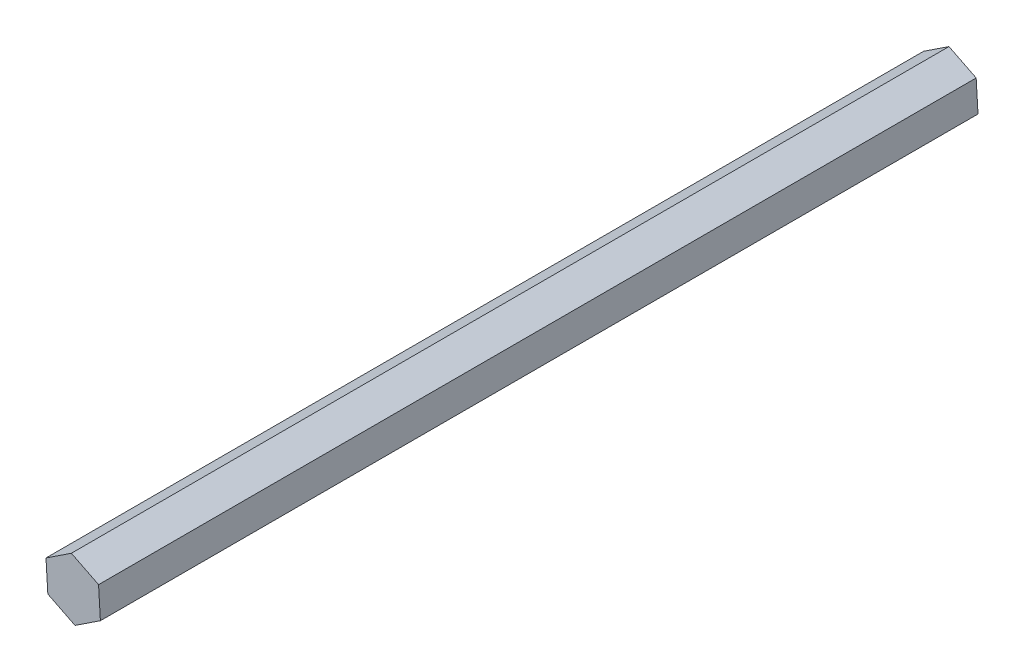
ISO-10303-21;
HEADER;
FILE_DESCRIPTION(('STEP AP214'),'2;1');
FILE_NAME('part.step','',(''),(''),'','','');
FILE_SCHEMA(('AUTOMOTIVE_DESIGN { 1 0 10303 214 1 1 1 1 }'));
ENDSEC;
DATA;
#1=APPLICATION_CONTEXT('core data for automotive mechanical design processes');
#2=APPLICATION_PROTOCOL_DEFINITION('international standard','automotive_design',2000,#1);
#3=PRODUCT_CONTEXT('',#1,'mechanical');
#4=PRODUCT('Part','Part','',(#3));
#5=PRODUCT_RELATED_PRODUCT_CATEGORY('part','',(#4));
#6=PRODUCT_DEFINITION_FORMATION('','',#4);
#7=PRODUCT_DEFINITION_CONTEXT('part definition',#1,'design');
#8=PRODUCT_DEFINITION('design','',#6,#7);
#9=PRODUCT_DEFINITION_SHAPE('','',#8);
#10=(LENGTH_UNIT() NAMED_UNIT(*) SI_UNIT(.MILLI.,.METRE.));
#11=(NAMED_UNIT(*) PLANE_ANGLE_UNIT() SI_UNIT($,.RADIAN.));
#12=(NAMED_UNIT(*) SI_UNIT($,.STERADIAN.) SOLID_ANGLE_UNIT());
#13=UNCERTAINTY_MEASURE_WITH_UNIT(LENGTH_MEASURE(1.E-05),#10,'distance_accuracy_value','');
#14=(GEOMETRIC_REPRESENTATION_CONTEXT(3) GLOBAL_UNCERTAINTY_ASSIGNED_CONTEXT((#13)) GLOBAL_UNIT_ASSIGNED_CONTEXT((#10,
#11,#12)) REPRESENTATION_CONTEXT('',''));
#15=CARTESIAN_POINT('',(0.,0.,0.));
#16=DIRECTION('',(0.,0.,1.));
#17=DIRECTION('',(1.,0.,0.));
#18=AXIS2_PLACEMENT_3D('',#15,#16,#17);
#19=CARTESIAN_POINT('',(-4.58919917341025,-3.03003728471628,158.75));
#20=DIRECTION('',(-0.998203466991462,-0.0599152608792244,0.));
#21=DIRECTION('',(0.0599152608792244,-0.998203466991462,0.));
#22=AXIS2_PLACEMENT_3D('',#19,#20,#21);
#23=PLANE('',#22);
#24=DIRECTION('',(-0.0599152608792244,0.998203466991462,0.));
#25=VECTOR('',#24,1.);
#26=CARTESIAN_POINT('',(-4.58919917341025,-3.03003728471628,0.));
#27=LINE('',#26,#25);
#28=CARTESIAN_POINT('',(-4.58919917341025,-3.03003728471628,0.));
#29=VERTEX_POINT('',#28);
#30=CARTESIAN_POINT('',(-4.91868884968345,2.45934442484167,0.));
#31=VERTEX_POINT('',#30);
#32=EDGE_CURVE('E118',#29,#31,#27,.T.);
#33=ORIENTED_EDGE('',*,*,#32,.F.);
#34=DIRECTION('',(0.,0.,-1.));
#35=VECTOR('',#34,1.);
#36=CARTESIAN_POINT('',(-4.58919917341025,-3.03003728471628,158.75));
#37=LINE('',#36,#35);
#38=CARTESIAN_POINT('',(-4.58919917341025,-3.03003728471628,158.75));
#39=VERTEX_POINT('',#38);
#40=EDGE_CURVE('E11',#39,#29,#37,.T.);
#41=ORIENTED_EDGE('',*,*,#40,.F.);
#42=DIRECTION('',(-0.0599152608792244,0.998203466991462,0.));
#43=VECTOR('',#42,1.);
#44=CARTESIAN_POINT('',(-4.58919917341025,-3.03003728471628,158.75));
#45=LINE('',#44,#43);
#46=CARTESIAN_POINT('',(-4.91868884968345,2.45934442484167,158.75));
#47=VERTEX_POINT('',#46);
#48=EDGE_CURVE('E132',#39,#47,#45,.T.);
#49=ORIENTED_EDGE('',*,*,#48,.T.);
#50=DIRECTION('',(0.,0.,-1.));
#51=VECTOR('',#50,1.);
#52=CARTESIAN_POINT('',(-4.91868884968345,2.45934442484167,158.75));
#53=LINE('',#52,#51);
#54=EDGE_CURVE('E36',#47,#31,#53,.T.);
#55=ORIENTED_EDGE('',*,*,#54,.T.);
#56=EDGE_LOOP('',(#33,#41,#49,#55));
#57=FACE_BOUND('',#56,.T.);
#58=ADVANCED_FACE('F33',(#57),#23,.T.);
#59=CARTESIAN_POINT('',(0.329489676273206,-5.48938170955796,158.75));
#60=DIRECTION('',(-0.44721359549995,-0.89442719099992,0.));
#61=DIRECTION('',(0.89442719099992,-0.44721359549995,0.));
#62=AXIS2_PLACEMENT_3D('',#59,#60,#61);
#63=PLANE('',#62);
#64=DIRECTION('',(-0.89442719099992,0.44721359549995,0.));
#65=VECTOR('',#64,1.);
#66=CARTESIAN_POINT('',(0.329489676273206,-5.48938170955796,0.));
#67=LINE('',#66,#65);
#68=CARTESIAN_POINT('',(0.329489676273206,-5.48938170955796,0.));
#69=VERTEX_POINT('',#68);
#70=EDGE_CURVE('E130',#69,#29,#67,.T.);
#71=ORIENTED_EDGE('',*,*,#70,.F.);
#72=DIRECTION('',(0.,0.,-1.));
#73=VECTOR('',#72,1.);
#74=CARTESIAN_POINT('',(0.329489676273206,-5.48938170955796,158.75));
#75=LINE('',#74,#73);
#76=CARTESIAN_POINT('',(0.329489676273206,-5.48938170955796,158.75));
#77=VERTEX_POINT('',#76);
#78=EDGE_CURVE('E42',#77,#69,#75,.T.);
#79=ORIENTED_EDGE('',*,*,#78,.F.);
#80=DIRECTION('',(-0.89442719099992,0.44721359549995,0.));
#81=VECTOR('',#80,1.);
#82=CARTESIAN_POINT('',(0.329489676273206,-5.48938170955796,158.75));
#83=LINE('',#82,#81);
#84=EDGE_CURVE('E108',#77,#39,#83,.T.);
#85=ORIENTED_EDGE('',*,*,#84,.T.);
#86=ORIENTED_EDGE('',*,*,#40,.T.);
#87=EDGE_LOOP('',(#71,#79,#85,#86));
#88=FACE_BOUND('',#87,.T.);
#89=ADVANCED_FACE('F140',(#88),#63,.T.);
#90=CARTESIAN_POINT('',(4.91868884968344,-2.45934442484167,158.75));
#91=DIRECTION('',(0.550989871491512,-0.834511930120695,0.));
#92=DIRECTION('',(0.834511930120695,0.550989871491512,0.));
#93=AXIS2_PLACEMENT_3D('',#90,#91,#92);
#94=PLANE('',#93);
#95=DIRECTION('',(-0.834511930120695,-0.550989871491512,0.));
#96=VECTOR('',#95,1.);
#97=CARTESIAN_POINT('',(4.91868884968344,-2.45934442484167,0.));
#98=LINE('',#97,#96);
#99=CARTESIAN_POINT('',(4.91868884968344,-2.45934442484167,0.));
#100=VERTEX_POINT('',#99);
#101=EDGE_CURVE('E95',#100,#69,#98,.T.);
#102=ORIENTED_EDGE('',*,*,#101,.F.);
#103=DIRECTION('',(0.,0.,-1.));
#104=VECTOR('',#103,1.);
#105=CARTESIAN_POINT('',(4.91868884968344,-2.45934442484167,158.75));
#106=LINE('',#105,#104);
#107=CARTESIAN_POINT('',(4.91868884968344,-2.45934442484167,158.75));
#108=VERTEX_POINT('',#107);
#109=EDGE_CURVE('E90',#108,#100,#106,.T.);
#110=ORIENTED_EDGE('',*,*,#109,.F.);
#111=DIRECTION('',(-0.834511930120695,-0.550989871491512,0.));
#112=VECTOR('',#111,1.);
#113=CARTESIAN_POINT('',(4.91868884968344,-2.45934442484167,158.75));
#114=LINE('',#113,#112);
#115=EDGE_CURVE('E93',#108,#77,#114,.T.);
#116=ORIENTED_EDGE('',*,*,#115,.T.);
#117=ORIENTED_EDGE('',*,*,#78,.T.);
#118=EDGE_LOOP('',(#102,#110,#116,#117));
#119=FACE_BOUND('',#118,.T.);
#120=ADVANCED_FACE('F92',(#119),#94,.T.);
#121=CARTESIAN_POINT('',(4.58919917341022,3.03003728471628,158.75));
#122=DIRECTION('',(0.998203466991462,0.0599152608792271,0.));
#123=DIRECTION('',(-0.0599152608792271,0.998203466991462,0.));
#124=AXIS2_PLACEMENT_3D('',#121,#122,#123);
#125=PLANE('',#124);
#126=DIRECTION('',(0.0599152608792271,-0.998203466991462,0.));
#127=VECTOR('',#126,1.);
#128=CARTESIAN_POINT('',(4.58919917341022,3.03003728471628,0.));
#129=LINE('',#128,#127);
#130=CARTESIAN_POINT('',(4.58919917341022,3.03003728471628,0.));
#131=VERTEX_POINT('',#130);
#132=EDGE_CURVE('E127',#131,#100,#129,.T.);
#133=ORIENTED_EDGE('',*,*,#132,.F.);
#134=DIRECTION('',(0.,0.,-1.));
#135=VECTOR('',#134,1.);
#136=CARTESIAN_POINT('',(4.58919917341022,3.03003728471628,158.75));
#137=LINE('',#136,#135);
#138=CARTESIAN_POINT('',(4.58919917341022,3.03003728471628,158.75));
#139=VERTEX_POINT('',#138);
#140=EDGE_CURVE('E100',#139,#131,#137,.T.);
#141=ORIENTED_EDGE('',*,*,#140,.F.);
#142=DIRECTION('',(0.0599152608792271,-0.998203466991462,0.));
#143=VECTOR('',#142,1.);
#144=CARTESIAN_POINT('',(4.58919917341022,3.03003728471628,158.75));
#145=LINE('',#144,#143);
#146=EDGE_CURVE('E106',#139,#108,#145,.T.);
#147=ORIENTED_EDGE('',*,*,#146,.T.);
#148=ORIENTED_EDGE('',*,*,#109,.T.);
#149=EDGE_LOOP('',(#133,#141,#147,#148));
#150=FACE_BOUND('',#149,.T.);
#151=ADVANCED_FACE('F110',(#150),#125,.T.);
#152=CARTESIAN_POINT('',(-0.32948967627321,5.48938170955796,158.75));
#153=DIRECTION('',(0.447213595499951,0.894427190999919,0.));
#154=DIRECTION('',(-0.894427190999919,0.447213595499951,0.));
#155=AXIS2_PLACEMENT_3D('',#152,#153,#154);
#156=PLANE('',#155);
#157=DIRECTION('',(0.894427190999919,-0.447213595499951,0.));
#158=VECTOR('',#157,1.);
#159=CARTESIAN_POINT('',(-0.32948967627321,5.48938170955796,0.));
#160=LINE('',#159,#158);
#161=CARTESIAN_POINT('',(-0.32948967627321,5.48938170955796,0.));
#162=VERTEX_POINT('',#161);
#163=EDGE_CURVE('E124',#162,#131,#160,.T.);
#164=ORIENTED_EDGE('',*,*,#163,.F.);
#165=DIRECTION('',(0.,0.,-1.));
#166=VECTOR('',#165,1.);
#167=CARTESIAN_POINT('',(-0.32948967627321,5.48938170955796,158.75));
#168=LINE('',#167,#166);
#169=CARTESIAN_POINT('',(-0.32948967627321,5.48938170955796,158.75));
#170=VERTEX_POINT('',#169);
#171=EDGE_CURVE('E135',#170,#162,#168,.T.);
#172=ORIENTED_EDGE('',*,*,#171,.F.);
#173=DIRECTION('',(0.894427190999919,-0.447213595499951,0.));
#174=VECTOR('',#173,1.);
#175=CARTESIAN_POINT('',(-0.32948967627321,5.48938170955796,158.75));
#176=LINE('',#175,#174);
#177=EDGE_CURVE('E111',#170,#139,#176,.T.);
#178=ORIENTED_EDGE('',*,*,#177,.T.);
#179=ORIENTED_EDGE('',*,*,#140,.T.);
#180=EDGE_LOOP('',(#164,#172,#178,#179));
#181=FACE_BOUND('',#180,.T.);
#182=ADVANCED_FACE('F153',(#181),#156,.T.);
#183=CARTESIAN_POINT('',(-4.91868884968345,2.45934442484167,158.75));
#184=DIRECTION('',(-0.550989871491512,0.834511930120695,0.));
#185=DIRECTION('',(-0.834511930120695,-0.550989871491512,0.));
#186=AXIS2_PLACEMENT_3D('',#183,#184,#185);
#187=PLANE('',#186);
#188=DIRECTION('',(0.834511930120695,0.550989871491512,0.));
#189=VECTOR('',#188,1.);
#190=CARTESIAN_POINT('',(-4.91868884968345,2.45934442484167,0.));
#191=LINE('',#190,#189);
#192=EDGE_CURVE('E121',#31,#162,#191,.T.);
#193=ORIENTED_EDGE('',*,*,#192,.F.);
#194=ORIENTED_EDGE('',*,*,#54,.F.);
#195=DIRECTION('',(0.834511930120695,0.550989871491512,0.));
#196=VECTOR('',#195,1.);
#197=CARTESIAN_POINT('',(-4.91868884968345,2.45934442484167,158.75));
#198=LINE('',#197,#196);
#199=EDGE_CURVE('E113',#47,#170,#198,.T.);
#200=ORIENTED_EDGE('',*,*,#199,.T.);
#201=ORIENTED_EDGE('',*,*,#171,.T.);
#202=EDGE_LOOP('',(#193,#194,#200,#201));
#203=FACE_BOUND('',#202,.T.);
#204=ADVANCED_FACE('F137',(#203),#187,.T.);
#205=CARTESIAN_POINT('',(0.,0.,158.75));
#206=DIRECTION('',(0.,0.,-1.));
#207=DIRECTION('',(-1.,0.,0.));
#208=AXIS2_PLACEMENT_3D('',#205,#206,#207);
#209=PLANE('',#208);
#210=ORIENTED_EDGE('',*,*,#48,.F.);
#211=ORIENTED_EDGE('',*,*,#84,.F.);
#212=ORIENTED_EDGE('',*,*,#115,.F.);
#213=ORIENTED_EDGE('',*,*,#146,.F.);
#214=ORIENTED_EDGE('',*,*,#177,.F.);
#215=ORIENTED_EDGE('',*,*,#199,.F.);
#216=EDGE_LOOP('',(#210,#211,#212,#213,#214,#215));
#217=FACE_BOUND('',#216,.T.);
#218=ADVANCED_FACE('F104',(#217),#209,.F.);
#219=CARTESIAN_POINT('',(0.,0.,0.));
#220=DIRECTION('',(0.,0.,-1.));
#221=DIRECTION('',(-1.,0.,0.));
#222=AXIS2_PLACEMENT_3D('',#219,#220,#221);
#223=PLANE('',#222);
#224=ORIENTED_EDGE('',*,*,#32,.T.);
#225=ORIENTED_EDGE('',*,*,#192,.T.);
#226=ORIENTED_EDGE('',*,*,#163,.T.);
#227=ORIENTED_EDGE('',*,*,#132,.T.);
#228=ORIENTED_EDGE('',*,*,#101,.T.);
#229=ORIENTED_EDGE('',*,*,#70,.T.);
#230=EDGE_LOOP('',(#224,#225,#226,#227,#228,#229));
#231=FACE_BOUND('',#230,.T.);
#232=ADVANCED_FACE('F139',(#231),#223,.T.);
#233=CLOSED_SHELL('',(#58,#89,#120,#151,#182,#204,#218,#232));
#234=MANIFOLD_SOLID_BREP('B2',#233);
#235=ADVANCED_BREP_SHAPE_REPRESENTATION('',(#18,#234),#14);
#236=SHAPE_DEFINITION_REPRESENTATION(#9,#235);
ENDSEC;
END-ISO-10303-21;
